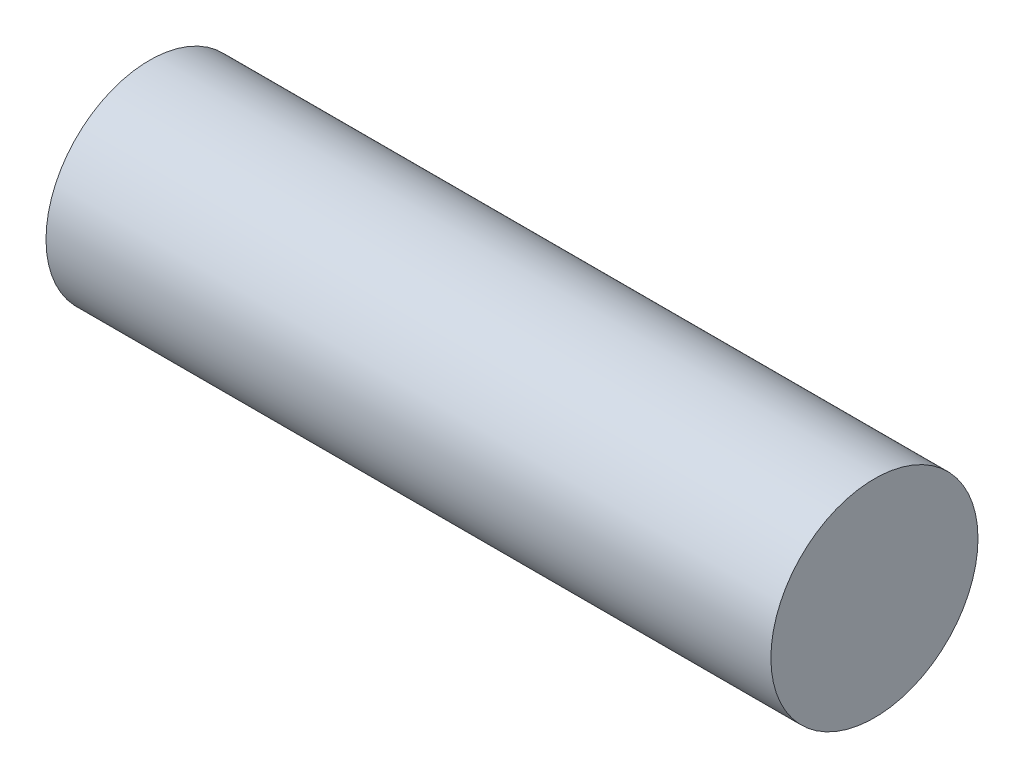
ISO-10303-21;
HEADER;
FILE_DESCRIPTION(('STEP AP214'),'2;1');
FILE_NAME('part.step','',(''),(''),'','','');
FILE_SCHEMA(('AUTOMOTIVE_DESIGN { 1 0 10303 214 1 1 1 1 }'));
ENDSEC;
DATA;
#1=APPLICATION_CONTEXT('core data for automotive mechanical design processes');
#2=APPLICATION_PROTOCOL_DEFINITION('international standard','automotive_design',2000,#1);
#3=PRODUCT_CONTEXT('',#1,'mechanical');
#4=PRODUCT('Part','Part','',(#3));
#5=PRODUCT_RELATED_PRODUCT_CATEGORY('part','',(#4));
#6=PRODUCT_DEFINITION_FORMATION('','',#4);
#7=PRODUCT_DEFINITION_CONTEXT('part definition',#1,'design');
#8=PRODUCT_DEFINITION('design','',#6,#7);
#9=PRODUCT_DEFINITION_SHAPE('','',#8);
#10=(LENGTH_UNIT() NAMED_UNIT(*) SI_UNIT(.MILLI.,.METRE.));
#11=(NAMED_UNIT(*) PLANE_ANGLE_UNIT() SI_UNIT($,.RADIAN.));
#12=(NAMED_UNIT(*) SI_UNIT($,.STERADIAN.) SOLID_ANGLE_UNIT());
#13=UNCERTAINTY_MEASURE_WITH_UNIT(LENGTH_MEASURE(1.E-05),#10,'distance_accuracy_value','');
#14=(GEOMETRIC_REPRESENTATION_CONTEXT(3) GLOBAL_UNCERTAINTY_ASSIGNED_CONTEXT((#13)) GLOBAL_UNIT_ASSIGNED_CONTEXT((#10,
#11,#12)) REPRESENTATION_CONTEXT('',''));
#15=CARTESIAN_POINT('',(0.,0.,0.));
#16=DIRECTION('',(0.,0.,1.));
#17=DIRECTION('',(1.,0.,0.));
#18=AXIS2_PLACEMENT_3D('',#15,#16,#17);
#19=CARTESIAN_POINT('',(70.,0.,0.));
#20=DIRECTION('',(-1.,0.,0.));
#21=DIRECTION('',(0.,0.,1.));
#22=AXIS2_PLACEMENT_3D('',#19,#20,#21);
#23=CYLINDRICAL_SURFACE('',#22,10.);
#24=CARTESIAN_POINT('',(70.,0.,0.));
#25=DIRECTION('',(1.,0.,0.));
#26=DIRECTION('',(0.,0.,-1.));
#27=AXIS2_PLACEMENT_3D('',#24,#25,#26);
#28=CIRCLE('',#27,10.);
#29=CARTESIAN_POINT('',(70.,0.,-10.));
#30=VERTEX_POINT('',#29);
#31=EDGE_CURVE('E10',#30,#30,#28,.T.);
#32=ORIENTED_EDGE('',*,*,#31,.F.);
#33=EDGE_LOOP('',(#32));
#34=FACE_BOUND('',#33,.T.);
#35=CARTESIAN_POINT('',(0.,0.,0.));
#36=DIRECTION('',(1.,0.,0.));
#37=DIRECTION('',(0.,0.,-1.));
#38=AXIS2_PLACEMENT_3D('',#35,#36,#37);
#39=CIRCLE('',#38,10.);
#40=CARTESIAN_POINT('',(0.,0.,-10.));
#41=VERTEX_POINT('',#40);
#42=EDGE_CURVE('E35',#41,#41,#39,.T.);
#43=ORIENTED_EDGE('',*,*,#42,.T.);
#44=EDGE_LOOP('',(#43));
#45=FACE_BOUND('',#44,.T.);
#46=ADVANCED_FACE('F32',(#34,#45),#23,.T.);
#47=CARTESIAN_POINT('',(70.,0.,0.));
#48=DIRECTION('',(1.,0.,0.));
#49=DIRECTION('',(0.,0.,-1.));
#50=AXIS2_PLACEMENT_3D('',#47,#48,#49);
#51=PLANE('',#50);
#52=ORIENTED_EDGE('',*,*,#31,.T.);
#53=EDGE_LOOP('',(#52));
#54=FACE_BOUND('',#53,.T.);
#55=ADVANCED_FACE('F47',(#54),#51,.T.);
#56=CARTESIAN_POINT('',(0.,0.,0.));
#57=DIRECTION('',(1.,0.,0.));
#58=DIRECTION('',(0.,0.,-1.));
#59=AXIS2_PLACEMENT_3D('',#56,#57,#58);
#60=PLANE('',#59);
#61=ORIENTED_EDGE('',*,*,#42,.F.);
#62=EDGE_LOOP('',(#61));
#63=FACE_BOUND('',#62,.T.);
#64=ADVANCED_FACE('F45',(#63),#60,.F.);
#65=CLOSED_SHELL('',(#46,#55,#64));
#66=MANIFOLD_SOLID_BREP('B2',#65);
#67=ADVANCED_BREP_SHAPE_REPRESENTATION('',(#18,#66),#14);
#68=SHAPE_DEFINITION_REPRESENTATION(#9,#67);
ENDSEC;
END-ISO-10303-21;
